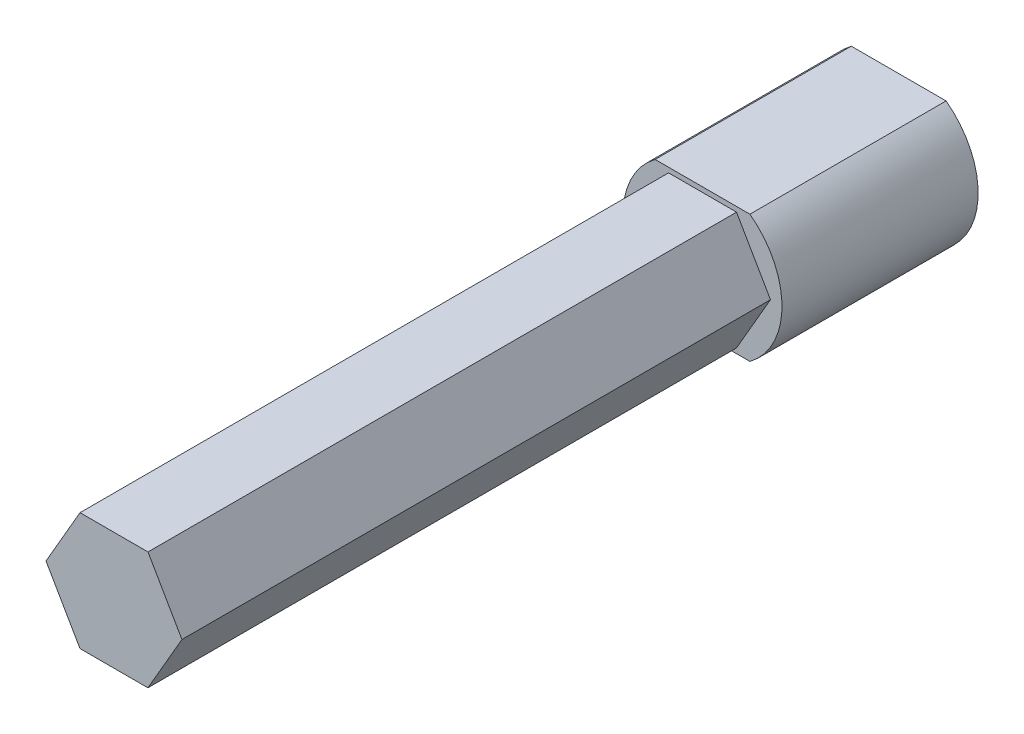
ISO-10303-21;
HEADER;
FILE_DESCRIPTION(('STEP AP214'),'2;1');
FILE_NAME('part.step','',(''),(''),'','','');
FILE_SCHEMA(('AUTOMOTIVE_DESIGN { 1 0 10303 214 1 1 1 1 }'));
ENDSEC;
DATA;
#1=APPLICATION_CONTEXT('core data for automotive mechanical design processes');
#2=APPLICATION_PROTOCOL_DEFINITION('international standard','automotive_design',2000,#1);
#3=PRODUCT_CONTEXT('',#1,'mechanical');
#4=PRODUCT('Part','Part','',(#3));
#5=PRODUCT_RELATED_PRODUCT_CATEGORY('part','',(#4));
#6=PRODUCT_DEFINITION_FORMATION('','',#4);
#7=PRODUCT_DEFINITION_CONTEXT('part definition',#1,'design');
#8=PRODUCT_DEFINITION('design','',#6,#7);
#9=PRODUCT_DEFINITION_SHAPE('','',#8);
#10=(LENGTH_UNIT() NAMED_UNIT(*) SI_UNIT(.MILLI.,.METRE.));
#11=(NAMED_UNIT(*) PLANE_ANGLE_UNIT() SI_UNIT($,.RADIAN.));
#12=(NAMED_UNIT(*) SI_UNIT($,.STERADIAN.) SOLID_ANGLE_UNIT());
#13=UNCERTAINTY_MEASURE_WITH_UNIT(LENGTH_MEASURE(1.E-05),#10,'distance_accuracy_value','');
#14=(GEOMETRIC_REPRESENTATION_CONTEXT(3) GLOBAL_UNCERTAINTY_ASSIGNED_CONTEXT((#13)) GLOBAL_UNIT_ASSIGNED_CONTEXT((#10,
#11,#12)) REPRESENTATION_CONTEXT('',''));
#15=CARTESIAN_POINT('',(0.,0.,0.));
#16=DIRECTION('',(0.,0.,1.));
#17=DIRECTION('',(1.,0.,0.));
#18=AXIS2_PLACEMENT_3D('',#15,#16,#17);
#19=CARTESIAN_POINT('',(0.,0.,10.));
#20=DIRECTION('',(0.,0.,-1.));
#21=DIRECTION('',(-1.,0.,0.));
#22=AXIS2_PLACEMENT_3D('',#19,#20,#21);
#23=CYLINDRICAL_SURFACE('',#22,4.05);
#24=CARTESIAN_POINT('',(0.,0.,0.));
#25=DIRECTION('',(0.,0.,1.));
#26=DIRECTION('',(1.,0.,0.));
#27=AXIS2_PLACEMENT_3D('',#24,#25,#26);
#28=CIRCLE('',#27,4.05);
#29=CARTESIAN_POINT('',(-2.41660919471891,3.25,0.));
#30=VERTEX_POINT('',#29);
#31=CARTESIAN_POINT('',(-2.41660919471891,-3.25,0.));
#32=VERTEX_POINT('',#31);
#33=EDGE_CURVE('E260',#30,#32,#28,.T.);
#34=ORIENTED_EDGE('',*,*,#33,.T.);
#35=DIRECTION('',(0.,0.,-1.));
#36=VECTOR('',#35,1.);
#37=CARTESIAN_POINT('',(-2.41660919471891,-3.25,10.));
#38=LINE('',#37,#36);
#39=CARTESIAN_POINT('',(-2.41660919471891,-3.25,10.));
#40=VERTEX_POINT('',#39);
#41=EDGE_CURVE('E11',#40,#32,#38,.T.);
#42=ORIENTED_EDGE('',*,*,#41,.F.);
#43=CARTESIAN_POINT('',(0.,0.,10.));
#44=DIRECTION('',(0.,0.,1.));
#45=DIRECTION('',(1.,0.,0.));
#46=AXIS2_PLACEMENT_3D('',#43,#44,#45);
#47=CIRCLE('',#46,4.05);
#48=CARTESIAN_POINT('',(-2.41660919471891,3.25,10.));
#49=VERTEX_POINT('',#48);
#50=EDGE_CURVE('E261',#49,#40,#47,.T.);
#51=ORIENTED_EDGE('',*,*,#50,.F.);
#52=DIRECTION('',(0.,0.,-1.));
#53=VECTOR('',#52,1.);
#54=CARTESIAN_POINT('',(-2.41660919471891,3.25,10.));
#55=LINE('',#54,#53);
#56=EDGE_CURVE('E275',#49,#30,#55,.T.);
#57=ORIENTED_EDGE('',*,*,#56,.T.);
#58=EDGE_LOOP('',(#34,#42,#51,#57));
#59=FACE_BOUND('',#58,.T.);
#60=ADVANCED_FACE('F45',(#59),#23,.T.);
#61=CARTESIAN_POINT('',(-2.41660919471891,-3.25,10.));
#62=DIRECTION('',(0.,1.,0.));
#63=DIRECTION('',(0.,0.,1.));
#64=AXIS2_PLACEMENT_3D('',#61,#62,#63);
#65=PLANE('',#64);
#66=DIRECTION('',(1.,0.,0.));
#67=VECTOR('',#66,1.);
#68=CARTESIAN_POINT('',(-2.41660919471891,-3.25,0.));
#69=LINE('',#68,#67);
#70=CARTESIAN_POINT('',(2.41660919471891,-3.25,0.));
#71=VERTEX_POINT('',#70);
#72=EDGE_CURVE('E279',#32,#71,#69,.T.);
#73=ORIENTED_EDGE('',*,*,#72,.T.);
#74=DIRECTION('',(0.,0.,-1.));
#75=VECTOR('',#74,1.);
#76=CARTESIAN_POINT('',(2.41660919471891,-3.25,10.));
#77=LINE('',#76,#75);
#78=CARTESIAN_POINT('',(2.41660919471891,-3.25,10.));
#79=VERTEX_POINT('',#78);
#80=EDGE_CURVE('E53',#79,#71,#77,.T.);
#81=ORIENTED_EDGE('',*,*,#80,.F.);
#82=DIRECTION('',(1.,0.,0.));
#83=VECTOR('',#82,1.);
#84=CARTESIAN_POINT('',(-2.41660919471891,-3.25,10.));
#85=LINE('',#84,#83);
#86=EDGE_CURVE('E265',#40,#79,#85,.T.);
#87=ORIENTED_EDGE('',*,*,#86,.F.);
#88=ORIENTED_EDGE('',*,*,#41,.T.);
#89=EDGE_LOOP('',(#73,#81,#87,#88));
#90=FACE_BOUND('',#89,.T.);
#91=ADVANCED_FACE('F315',(#90),#65,.F.);
#92=CARTESIAN_POINT('',(0.,0.,10.));
#93=DIRECTION('',(0.,0.,-1.));
#94=DIRECTION('',(-1.,0.,0.));
#95=AXIS2_PLACEMENT_3D('',#92,#93,#94);
#96=CYLINDRICAL_SURFACE('',#95,4.05);
#97=CARTESIAN_POINT('',(0.,0.,0.));
#98=DIRECTION('',(0.,0.,1.));
#99=DIRECTION('',(1.,0.,0.));
#100=AXIS2_PLACEMENT_3D('',#97,#98,#99);
#101=CIRCLE('',#100,4.05);
#102=CARTESIAN_POINT('',(2.41660919471891,3.25,0.));
#103=VERTEX_POINT('',#102);
#104=EDGE_CURVE('E282',#71,#103,#101,.T.);
#105=ORIENTED_EDGE('',*,*,#104,.T.);
#106=DIRECTION('',(0.,0.,-1.));
#107=VECTOR('',#106,1.);
#108=CARTESIAN_POINT('',(2.41660919471891,3.25,10.));
#109=LINE('',#108,#107);
#110=CARTESIAN_POINT('',(2.41660919471891,3.25,10.));
#111=VERTEX_POINT('',#110);
#112=EDGE_CURVE('E290',#111,#103,#109,.T.);
#113=ORIENTED_EDGE('',*,*,#112,.F.);
#114=CARTESIAN_POINT('',(0.,0.,10.));
#115=DIRECTION('',(0.,0.,1.));
#116=DIRECTION('',(1.,0.,0.));
#117=AXIS2_PLACEMENT_3D('',#114,#115,#116);
#118=CIRCLE('',#117,4.05);
#119=EDGE_CURVE('E269',#79,#111,#118,.T.);
#120=ORIENTED_EDGE('',*,*,#119,.F.);
#121=ORIENTED_EDGE('',*,*,#80,.T.);
#122=EDGE_LOOP('',(#105,#113,#120,#121));
#123=FACE_BOUND('',#122,.T.);
#124=ADVANCED_FACE('F299',(#123),#96,.T.);
#125=CARTESIAN_POINT('',(-2.41660919471891,3.25,10.));
#126=DIRECTION('',(0.,-1.,0.));
#127=DIRECTION('',(0.,0.,-1.));
#128=AXIS2_PLACEMENT_3D('',#125,#126,#127);
#129=PLANE('',#128);
#130=DIRECTION('',(-1.,0.,0.));
#131=VECTOR('',#130,1.);
#132=CARTESIAN_POINT('',(-2.41660919471891,3.25,0.));
#133=LINE('',#132,#131);
#134=EDGE_CURVE('E266',#103,#30,#133,.T.);
#135=ORIENTED_EDGE('',*,*,#134,.T.);
#136=ORIENTED_EDGE('',*,*,#56,.F.);
#137=DIRECTION('',(-1.,0.,0.));
#138=VECTOR('',#137,1.);
#139=CARTESIAN_POINT('',(-2.41660919471891,3.25,10.));
#140=LINE('',#139,#138);
#141=EDGE_CURVE('E272',#111,#49,#140,.T.);
#142=ORIENTED_EDGE('',*,*,#141,.F.);
#143=ORIENTED_EDGE('',*,*,#112,.T.);
#144=EDGE_LOOP('',(#135,#136,#142,#143));
#145=FACE_BOUND('',#144,.T.);
#146=ADVANCED_FACE('F308',(#145),#129,.F.);
#147=CARTESIAN_POINT('',(0.,0.,10.));
#148=DIRECTION('',(0.,0.,1.));
#149=DIRECTION('',(1.,0.,0.));
#150=AXIS2_PLACEMENT_3D('',#147,#148,#149);
#151=PLANE('',#150);
#152=DIRECTION('',(0.999999819928611,-0.000600118943034689,0.));
#153=VECTOR('',#152,1.);
#154=CARTESIAN_POINT('',(-1.73385085250519,-2.99896002328591,10.));
#155=LINE('',#154,#153);
#156=CARTESIAN_POINT('',(-1.73385085250519,-2.99896002328591,10.));
#157=VERTEX_POINT('',#156);
#158=CARTESIAN_POINT('',(1.73025013884698,-3.00103889628575,10.));
#159=VERTEX_POINT('',#158);
#160=EDGE_CURVE('E68',#157,#159,#155,.T.);
#161=ORIENTED_EDGE('',*,*,#160,.F.);
#162=DIRECTION('',(0.499480191714345,-0.866325307309559,0.));
#163=VECTOR('',#162,1.);
#164=CARTESIAN_POINT('',(-3.46410099135217,0.00207887299984251,10.));
#165=LINE('',#164,#163);
#166=CARTESIAN_POINT('',(-3.46410099135217,0.00207887299984251,10.));
#167=VERTEX_POINT('',#166);
#168=EDGE_CURVE('E201',#167,#157,#165,.T.);
#169=ORIENTED_EDGE('',*,*,#168,.F.);
#170=DIRECTION('',(-0.500519628214266,-0.865725188366524,0.));
#171=VECTOR('',#170,1.);
#172=CARTESIAN_POINT('',(-1.73025013884698,3.00103889628575,10.));
#173=LINE('',#172,#171);
#174=CARTESIAN_POINT('',(-1.73025013884698,3.00103889628575,10.));
#175=VERTEX_POINT('',#174);
#176=EDGE_CURVE('E231',#175,#167,#173,.T.);
#177=ORIENTED_EDGE('',*,*,#176,.F.);
#178=DIRECTION('',(-0.999999819928611,0.000600118943034564,0.));
#179=VECTOR('',#178,1.);
#180=CARTESIAN_POINT('',(1.73385085250519,2.99896002328591,10.));
#181=LINE('',#180,#179);
#182=CARTESIAN_POINT('',(1.73385085250519,2.99896002328591,10.));
#183=VERTEX_POINT('',#182);
#184=EDGE_CURVE('E227',#183,#175,#181,.T.);
#185=ORIENTED_EDGE('',*,*,#184,.F.);
#186=DIRECTION('',(-0.499480191714345,0.866325307309558,0.));
#187=VECTOR('',#186,1.);
#188=CARTESIAN_POINT('',(3.46410099135216,-0.00207887299984231,10.));
#189=LINE('',#188,#187);
#190=CARTESIAN_POINT('',(3.46410099135216,-0.00207887299984231,10.));
#191=VERTEX_POINT('',#190);
#192=EDGE_CURVE('E223',#191,#183,#189,.T.);
#193=ORIENTED_EDGE('',*,*,#192,.F.);
#194=DIRECTION('',(0.500519628214266,0.865725188366524,0.));
#195=VECTOR('',#194,1.);
#196=CARTESIAN_POINT('',(1.73025013884698,-3.00103889628575,10.));
#197=LINE('',#196,#195);
#198=EDGE_CURVE('E219',#159,#191,#197,.T.);
#199=ORIENTED_EDGE('',*,*,#198,.F.);
#200=EDGE_LOOP('',(#161,#169,#177,#185,#193,#199));
#201=FACE_BOUND('',#200,.T.);
#202=ORIENTED_EDGE('',*,*,#50,.T.);
#203=ORIENTED_EDGE('',*,*,#86,.T.);
#204=ORIENTED_EDGE('',*,*,#119,.T.);
#205=ORIENTED_EDGE('',*,*,#141,.T.);
#206=EDGE_LOOP('',(#202,#203,#204,#205));
#207=FACE_BOUND('',#206,.T.);
#208=ADVANCED_FACE('F314',(#201,#207),#151,.T.);
#209=CARTESIAN_POINT('',(0.,0.,0.));
#210=DIRECTION('',(0.,0.,1.));
#211=DIRECTION('',(1.,0.,0.));
#212=AXIS2_PLACEMENT_3D('',#209,#210,#211);
#213=PLANE('',#212);
#214=DIRECTION('',(1.,0.,0.));
#215=VECTOR('',#214,1.);
#216=CARTESIAN_POINT('',(-2.20907220343745,2.65,0.));
#217=LINE('',#216,#215);
#218=CARTESIAN_POINT('',(-2.20907220343745,2.65,0.));
#219=VERTEX_POINT('',#218);
#220=CARTESIAN_POINT('',(2.20907220343745,2.65,0.));
#221=VERTEX_POINT('',#220);
#222=EDGE_CURVE('E182',#219,#221,#217,.T.);
#223=ORIENTED_EDGE('',*,*,#222,.F.);
#224=CARTESIAN_POINT('',(0.,0.,0.));
#225=DIRECTION('',(0.,0.,-1.));
#226=DIRECTION('',(-1.,0.,0.));
#227=AXIS2_PLACEMENT_3D('',#224,#225,#226);
#228=CIRCLE('',#227,3.45);
#229=CARTESIAN_POINT('',(-2.20907220343745,-2.65,0.));
#230=VERTEX_POINT('',#229);
#231=EDGE_CURVE('E60',#230,#219,#228,.T.);
#232=ORIENTED_EDGE('',*,*,#231,.F.);
#233=DIRECTION('',(-1.,0.,0.));
#234=VECTOR('',#233,1.);
#235=CARTESIAN_POINT('',(2.20907220343745,-2.65,0.));
#236=LINE('',#235,#234);
#237=CARTESIAN_POINT('',(2.20907220343745,-2.65,0.));
#238=VERTEX_POINT('',#237);
#239=EDGE_CURVE('E169',#238,#230,#236,.T.);
#240=ORIENTED_EDGE('',*,*,#239,.F.);
#241=CARTESIAN_POINT('',(0.,0.,0.));
#242=DIRECTION('',(0.,0.,-1.));
#243=DIRECTION('',(-1.,0.,0.));
#244=AXIS2_PLACEMENT_3D('',#241,#242,#243);
#245=CIRCLE('',#244,3.45);
#246=EDGE_CURVE('E173',#221,#238,#245,.T.);
#247=ORIENTED_EDGE('',*,*,#246,.F.);
#248=EDGE_LOOP('',(#223,#232,#240,#247));
#249=FACE_BOUND('',#248,.T.);
#250=ORIENTED_EDGE('',*,*,#33,.F.);
#251=ORIENTED_EDGE('',*,*,#134,.F.);
#252=ORIENTED_EDGE('',*,*,#104,.F.);
#253=ORIENTED_EDGE('',*,*,#72,.F.);
#254=EDGE_LOOP('',(#250,#251,#252,#253));
#255=FACE_BOUND('',#254,.T.);
#256=ADVANCED_FACE('F305',(#249,#255),#213,.F.);
#257=CARTESIAN_POINT('',(-1.73385085250519,-2.99896002328591,40.));
#258=DIRECTION('',(0.000600118943034689,0.999999819928611,0.));
#259=DIRECTION('',(-0.999999819928611,0.000600118943034689,0.));
#260=AXIS2_PLACEMENT_3D('',#257,#258,#259);
#261=PLANE('',#260);
#262=ORIENTED_EDGE('',*,*,#160,.T.);
#263=DIRECTION('',(0.,0.,-1.));
#264=VECTOR('',#263,1.);
#265=CARTESIAN_POINT('',(1.73025013884698,-3.00103889628575,40.));
#266=LINE('',#265,#264);
#267=CARTESIAN_POINT('',(1.73025013884698,-3.00103889628575,40.));
#268=VERTEX_POINT('',#267);
#269=EDGE_CURVE('E256',#268,#159,#266,.T.);
#270=ORIENTED_EDGE('',*,*,#269,.F.);
#271=DIRECTION('',(0.999999819928611,-0.000600118943034689,0.));
#272=VECTOR('',#271,1.);
#273=CARTESIAN_POINT('',(-1.73385085250519,-2.99896002328591,40.));
#274=LINE('',#273,#272);
#275=CARTESIAN_POINT('',(-1.73385085250519,-2.99896002328591,40.));
#276=VERTEX_POINT('',#275);
#277=EDGE_CURVE('E196',#276,#268,#274,.T.);
#278=ORIENTED_EDGE('',*,*,#277,.F.);
#279=DIRECTION('',(0.,0.,-1.));
#280=VECTOR('',#279,1.);
#281=CARTESIAN_POINT('',(-1.73385085250519,-2.99896002328591,40.));
#282=LINE('',#281,#280);
#283=EDGE_CURVE('E216',#276,#157,#282,.T.);
#284=ORIENTED_EDGE('',*,*,#283,.T.);
#285=EDGE_LOOP('',(#262,#270,#278,#284));
#286=FACE_BOUND('',#285,.T.);
#287=ADVANCED_FACE('F327',(#286),#261,.F.);
#288=CARTESIAN_POINT('',(1.73025013884698,-3.00103889628575,40.));
#289=DIRECTION('',(-0.865725188366524,0.500519628214266,0.));
#290=DIRECTION('',(-0.500519628214266,-0.865725188366524,0.));
#291=AXIS2_PLACEMENT_3D('',#288,#289,#290);
#292=PLANE('',#291);
#293=ORIENTED_EDGE('',*,*,#198,.T.);
#294=DIRECTION('',(0.,0.,-1.));
#295=VECTOR('',#294,1.);
#296=CARTESIAN_POINT('',(3.46410099135216,-0.00207887299984231,40.));
#297=LINE('',#296,#295);
#298=CARTESIAN_POINT('',(3.46410099135216,-0.00207887299984231,40.));
#299=VERTEX_POINT('',#298);
#300=EDGE_CURVE('E252',#299,#191,#297,.T.);
#301=ORIENTED_EDGE('',*,*,#300,.F.);
#302=DIRECTION('',(0.500519628214266,0.865725188366524,0.));
#303=VECTOR('',#302,1.);
#304=CARTESIAN_POINT('',(1.73025013884698,-3.00103889628575,40.));
#305=LINE('',#304,#303);
#306=EDGE_CURVE('E200',#268,#299,#305,.T.);
#307=ORIENTED_EDGE('',*,*,#306,.F.);
#308=ORIENTED_EDGE('',*,*,#269,.T.);
#309=EDGE_LOOP('',(#293,#301,#307,#308));
#310=FACE_BOUND('',#309,.T.);
#311=ADVANCED_FACE('F333',(#310),#292,.F.);
#312=CARTESIAN_POINT('',(3.46410099135216,-0.00207887299984231,40.));
#313=DIRECTION('',(-0.866325307309558,-0.499480191714345,0.));
#314=DIRECTION('',(0.499480191714345,-0.866325307309558,0.));
#315=AXIS2_PLACEMENT_3D('',#312,#313,#314);
#316=PLANE('',#315);
#317=ORIENTED_EDGE('',*,*,#192,.T.);
#318=DIRECTION('',(0.,0.,-1.));
#319=VECTOR('',#318,1.);
#320=CARTESIAN_POINT('',(1.73385085250519,2.99896002328591,40.));
#321=LINE('',#320,#319);
#322=CARTESIAN_POINT('',(1.73385085250519,2.99896002328591,40.));
#323=VERTEX_POINT('',#322);
#324=EDGE_CURVE('E248',#323,#183,#321,.T.);
#325=ORIENTED_EDGE('',*,*,#324,.F.);
#326=DIRECTION('',(-0.499480191714345,0.866325307309558,0.));
#327=VECTOR('',#326,1.);
#328=CARTESIAN_POINT('',(3.46410099135216,-0.00207887299984231,40.));
#329=LINE('',#328,#327);
#330=EDGE_CURVE('E204',#299,#323,#329,.T.);
#331=ORIENTED_EDGE('',*,*,#330,.F.);
#332=ORIENTED_EDGE('',*,*,#300,.T.);
#333=EDGE_LOOP('',(#317,#325,#331,#332));
#334=FACE_BOUND('',#333,.T.);
#335=ADVANCED_FACE('F337',(#334),#316,.F.);
#336=CARTESIAN_POINT('',(1.73385085250519,2.99896002328591,40.));
#337=DIRECTION('',(-0.000600118943034564,-0.999999819928611,0.));
#338=DIRECTION('',(0.999999819928611,-0.000600118943034564,0.));
#339=AXIS2_PLACEMENT_3D('',#336,#337,#338);
#340=PLANE('',#339);
#341=ORIENTED_EDGE('',*,*,#184,.T.);
#342=DIRECTION('',(0.,0.,-1.));
#343=VECTOR('',#342,1.);
#344=CARTESIAN_POINT('',(-1.73025013884698,3.00103889628575,40.));
#345=LINE('',#344,#343);
#346=CARTESIAN_POINT('',(-1.73025013884698,3.00103889628575,40.));
#347=VERTEX_POINT('',#346);
#348=EDGE_CURVE('E244',#347,#175,#345,.T.);
#349=ORIENTED_EDGE('',*,*,#348,.F.);
#350=DIRECTION('',(-0.999999819928611,0.000600118943034564,0.));
#351=VECTOR('',#350,1.);
#352=CARTESIAN_POINT('',(1.73385085250519,2.99896002328591,40.));
#353=LINE('',#352,#351);
#354=EDGE_CURVE('E207',#323,#347,#353,.T.);
#355=ORIENTED_EDGE('',*,*,#354,.F.);
#356=ORIENTED_EDGE('',*,*,#324,.T.);
#357=EDGE_LOOP('',(#341,#349,#355,#356));
#358=FACE_BOUND('',#357,.T.);
#359=ADVANCED_FACE('F341',(#358),#340,.F.);
#360=CARTESIAN_POINT('',(-1.73025013884698,3.00103889628575,40.));
#361=DIRECTION('',(0.865725188366524,-0.500519628214266,0.));
#362=DIRECTION('',(0.500519628214266,0.865725188366524,0.));
#363=AXIS2_PLACEMENT_3D('',#360,#361,#362);
#364=PLANE('',#363);
#365=ORIENTED_EDGE('',*,*,#176,.T.);
#366=DIRECTION('',(0.,0.,-1.));
#367=VECTOR('',#366,1.);
#368=CARTESIAN_POINT('',(-3.46410099135217,0.00207887299984251,40.));
#369=LINE('',#368,#367);
#370=CARTESIAN_POINT('',(-3.46410099135217,0.00207887299984251,40.));
#371=VERTEX_POINT('',#370);
#372=EDGE_CURVE('E240',#371,#167,#369,.T.);
#373=ORIENTED_EDGE('',*,*,#372,.F.);
#374=DIRECTION('',(-0.500519628214266,-0.865725188366524,0.));
#375=VECTOR('',#374,1.);
#376=CARTESIAN_POINT('',(-1.73025013884698,3.00103889628575,40.));
#377=LINE('',#376,#375);
#378=EDGE_CURVE('E210',#347,#371,#377,.T.);
#379=ORIENTED_EDGE('',*,*,#378,.F.);
#380=ORIENTED_EDGE('',*,*,#348,.T.);
#381=EDGE_LOOP('',(#365,#373,#379,#380));
#382=FACE_BOUND('',#381,.T.);
#383=ADVANCED_FACE('F345',(#382),#364,.F.);
#384=CARTESIAN_POINT('',(-3.46410099135217,0.00207887299984251,40.));
#385=DIRECTION('',(0.866325307309559,0.499480191714345,0.));
#386=DIRECTION('',(-0.499480191714345,0.866325307309559,0.));
#387=AXIS2_PLACEMENT_3D('',#384,#385,#386);
#388=PLANE('',#387);
#389=ORIENTED_EDGE('',*,*,#168,.T.);
#390=ORIENTED_EDGE('',*,*,#283,.F.);
#391=DIRECTION('',(0.499480191714345,-0.866325307309559,0.));
#392=VECTOR('',#391,1.);
#393=CARTESIAN_POINT('',(-3.46410099135217,0.00207887299984251,40.));
#394=LINE('',#393,#392);
#395=EDGE_CURVE('E213',#371,#276,#394,.T.);
#396=ORIENTED_EDGE('',*,*,#395,.F.);
#397=ORIENTED_EDGE('',*,*,#372,.T.);
#398=EDGE_LOOP('',(#389,#390,#396,#397));
#399=FACE_BOUND('',#398,.T.);
#400=ADVANCED_FACE('F349',(#399),#388,.F.);
#401=CARTESIAN_POINT('',(0.,0.,40.));
#402=DIRECTION('',(0.,0.,1.));
#403=DIRECTION('',(1.,0.,0.));
#404=AXIS2_PLACEMENT_3D('',#401,#402,#403);
#405=PLANE('',#404);
#406=ORIENTED_EDGE('',*,*,#277,.T.);
#407=ORIENTED_EDGE('',*,*,#306,.T.);
#408=ORIENTED_EDGE('',*,*,#330,.T.);
#409=ORIENTED_EDGE('',*,*,#354,.T.);
#410=ORIENTED_EDGE('',*,*,#378,.T.);
#411=ORIENTED_EDGE('',*,*,#395,.T.);
#412=EDGE_LOOP('',(#406,#407,#408,#409,#410,#411));
#413=FACE_BOUND('',#412,.T.);
#414=ADVANCED_FACE('F353',(#413),#405,.T.);
#415=CARTESIAN_POINT('',(0.,0.,5.));
#416=DIRECTION('',(0.,0.,-1.));
#417=DIRECTION('',(-1.,0.,0.));
#418=AXIS2_PLACEMENT_3D('',#415,#416,#417);
#419=CYLINDRICAL_SURFACE('',#418,3.45);
#420=ORIENTED_EDGE('',*,*,#231,.T.);
#421=DIRECTION('',(0.,0.,-1.));
#422=VECTOR('',#421,1.);
#423=CARTESIAN_POINT('',(-2.20907220343745,2.65,5.));
#424=LINE('',#423,#422);
#425=CARTESIAN_POINT('',(-2.20907220343745,2.65,5.));
#426=VERTEX_POINT('',#425);
#427=EDGE_CURVE('E144',#426,#219,#424,.T.);
#428=ORIENTED_EDGE('',*,*,#427,.F.);
#429=CARTESIAN_POINT('',(0.,0.,5.));
#430=DIRECTION('',(0.,0.,-1.));
#431=DIRECTION('',(-1.,0.,0.));
#432=AXIS2_PLACEMENT_3D('',#429,#430,#431);
#433=CIRCLE('',#432,3.45);
#434=CARTESIAN_POINT('',(-2.20907220343745,-2.65,5.));
#435=VERTEX_POINT('',#434);
#436=EDGE_CURVE('E148',#435,#426,#433,.T.);
#437=ORIENTED_EDGE('',*,*,#436,.F.);
#438=DIRECTION('',(0.,0.,-1.));
#439=VECTOR('',#438,1.);
#440=CARTESIAN_POINT('',(-2.20907220343745,-2.65,5.));
#441=LINE('',#440,#439);
#442=EDGE_CURVE('E188',#435,#230,#441,.T.);
#443=ORIENTED_EDGE('',*,*,#442,.T.);
#444=EDGE_LOOP('',(#420,#428,#437,#443));
#445=FACE_BOUND('',#444,.T.);
#446=ADVANCED_FACE('F146',(#445),#419,.F.);
#447=CARTESIAN_POINT('',(2.20907220343745,-2.65,5.));
#448=DIRECTION('',(0.,-1.,0.));
#449=DIRECTION('',(0.,0.,-1.));
#450=AXIS2_PLACEMENT_3D('',#447,#448,#449);
#451=PLANE('',#450);
#452=ORIENTED_EDGE('',*,*,#239,.T.);
#453=ORIENTED_EDGE('',*,*,#442,.F.);
#454=DIRECTION('',(-1.,0.,0.));
#455=VECTOR('',#454,1.);
#456=CARTESIAN_POINT('',(2.20907220343745,-2.65,5.));
#457=LINE('',#456,#455);
#458=CARTESIAN_POINT('',(2.20907220343745,-2.65,5.));
#459=VERTEX_POINT('',#458);
#460=EDGE_CURVE('E155',#459,#435,#457,.T.);
#461=ORIENTED_EDGE('',*,*,#460,.F.);
#462=DIRECTION('',(0.,0.,-1.));
#463=VECTOR('',#462,1.);
#464=CARTESIAN_POINT('',(2.20907220343745,-2.65,5.));
#465=LINE('',#464,#463);
#466=EDGE_CURVE('E191',#459,#238,#465,.T.);
#467=ORIENTED_EDGE('',*,*,#466,.T.);
#468=EDGE_LOOP('',(#452,#453,#461,#467));
#469=FACE_BOUND('',#468,.T.);
#470=ADVANCED_FACE('F360',(#469),#451,.F.);
#471=CARTESIAN_POINT('',(0.,0.,5.));
#472=DIRECTION('',(0.,0.,-1.));
#473=DIRECTION('',(-1.,0.,0.));
#474=AXIS2_PLACEMENT_3D('',#471,#472,#473);
#475=CYLINDRICAL_SURFACE('',#474,3.45);
#476=ORIENTED_EDGE('',*,*,#246,.T.);
#477=ORIENTED_EDGE('',*,*,#466,.F.);
#478=CARTESIAN_POINT('',(0.,0.,5.));
#479=DIRECTION('',(0.,0.,-1.));
#480=DIRECTION('',(-1.,0.,0.));
#481=AXIS2_PLACEMENT_3D('',#478,#479,#480);
#482=CIRCLE('',#481,3.45);
#483=CARTESIAN_POINT('',(2.20907220343745,2.65,5.));
#484=VERTEX_POINT('',#483);
#485=EDGE_CURVE('E164',#484,#459,#482,.T.);
#486=ORIENTED_EDGE('',*,*,#485,.F.);
#487=DIRECTION('',(0.,0.,-1.));
#488=VECTOR('',#487,1.);
#489=CARTESIAN_POINT('',(2.20907220343745,2.65,5.));
#490=LINE('',#489,#488);
#491=EDGE_CURVE('E154',#484,#221,#490,.T.);
#492=ORIENTED_EDGE('',*,*,#491,.T.);
#493=EDGE_LOOP('',(#476,#477,#486,#492));
#494=FACE_BOUND('',#493,.T.);
#495=ADVANCED_FACE('F363',(#494),#475,.F.);
#496=CARTESIAN_POINT('',(-2.20907220343745,2.65,5.));
#497=DIRECTION('',(0.,1.,0.));
#498=DIRECTION('',(-1.,0.,0.));
#499=AXIS2_PLACEMENT_3D('',#496,#497,#498);
#500=PLANE('',#499);
#501=ORIENTED_EDGE('',*,*,#222,.T.);
#502=ORIENTED_EDGE('',*,*,#491,.F.);
#503=DIRECTION('',(1.,0.,0.));
#504=VECTOR('',#503,1.);
#505=CARTESIAN_POINT('',(-2.20907220343745,2.65,5.));
#506=LINE('',#505,#504);
#507=EDGE_CURVE('E158',#426,#484,#506,.T.);
#508=ORIENTED_EDGE('',*,*,#507,.F.);
#509=ORIENTED_EDGE('',*,*,#427,.T.);
#510=EDGE_LOOP('',(#501,#502,#508,#509));
#511=FACE_BOUND('',#510,.T.);
#512=ADVANCED_FACE('F159',(#511),#500,.F.);
#513=CARTESIAN_POINT('',(0.,0.,5.));
#514=DIRECTION('',(0.,0.,-1.));
#515=DIRECTION('',(-1.,0.,0.));
#516=AXIS2_PLACEMENT_3D('',#513,#514,#515);
#517=PLANE('',#516);
#518=ORIENTED_EDGE('',*,*,#436,.T.);
#519=ORIENTED_EDGE('',*,*,#507,.T.);
#520=ORIENTED_EDGE('',*,*,#485,.T.);
#521=ORIENTED_EDGE('',*,*,#460,.T.);
#522=EDGE_LOOP('',(#518,#519,#520,#521));
#523=FACE_BOUND('',#522,.T.);
#524=ADVANCED_FACE('F166',(#523),#517,.T.);
#525=CLOSED_SHELL('',(#60,#91,#124,#146,#208,#256,#287,#311,#335,#359,#383,#400,#414,#446,#470,
#495,#512,#524));
#526=MANIFOLD_SOLID_BREP('B2',#525);
#527=ADVANCED_BREP_SHAPE_REPRESENTATION('',(#18,#526),#14);
#528=SHAPE_DEFINITION_REPRESENTATION(#9,#527);
ENDSEC;
END-ISO-10303-21;
